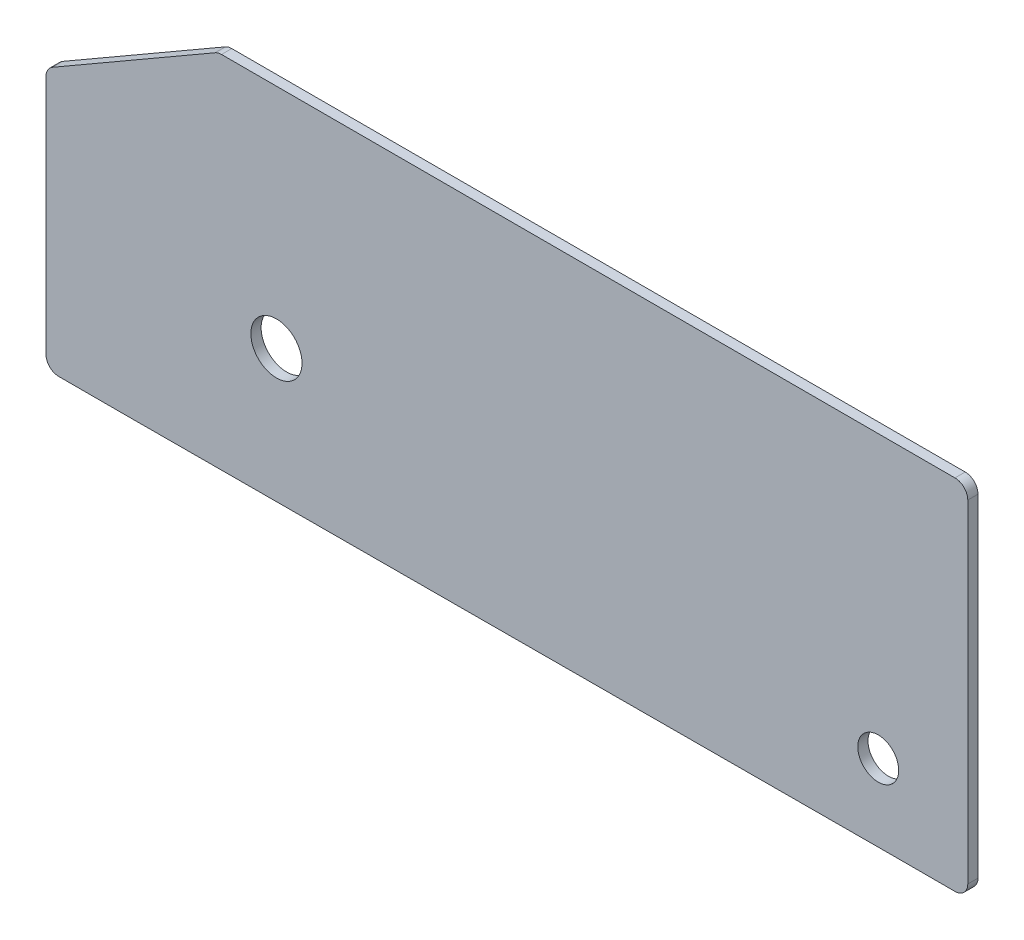
ISO-10303-21;
HEADER;
FILE_DESCRIPTION(('STEP AP214'),'2;1');
FILE_NAME('part.step','',(''),(''),'','','');
FILE_SCHEMA(('AUTOMOTIVE_DESIGN { 1 0 10303 214 1 1 1 1 }'));
ENDSEC;
DATA;
#1=APPLICATION_CONTEXT('core data for automotive mechanical design processes');
#2=APPLICATION_PROTOCOL_DEFINITION('international standard','automotive_design',2000,#1);
#3=PRODUCT_CONTEXT('',#1,'mechanical');
#4=PRODUCT('Part','Part','',(#3));
#5=PRODUCT_RELATED_PRODUCT_CATEGORY('part','',(#4));
#6=PRODUCT_DEFINITION_FORMATION('','',#4);
#7=PRODUCT_DEFINITION_CONTEXT('part definition',#1,'design');
#8=PRODUCT_DEFINITION('design','',#6,#7);
#9=PRODUCT_DEFINITION_SHAPE('','',#8);
#10=(LENGTH_UNIT() NAMED_UNIT(*) SI_UNIT(.MILLI.,.METRE.));
#11=(NAMED_UNIT(*) PLANE_ANGLE_UNIT() SI_UNIT($,.RADIAN.));
#12=(NAMED_UNIT(*) SI_UNIT($,.STERADIAN.) SOLID_ANGLE_UNIT());
#13=UNCERTAINTY_MEASURE_WITH_UNIT(LENGTH_MEASURE(1.E-05),#10,'distance_accuracy_value','');
#14=(GEOMETRIC_REPRESENTATION_CONTEXT(3) GLOBAL_UNCERTAINTY_ASSIGNED_CONTEXT((#13)) GLOBAL_UNIT_ASSIGNED_CONTEXT((#10,
#11,#12)) REPRESENTATION_CONTEXT('',''));
#15=CARTESIAN_POINT('',(0.,0.,0.));
#16=DIRECTION('',(0.,0.,1.));
#17=DIRECTION('',(1.,0.,0.));
#18=AXIS2_PLACEMENT_3D('',#15,#16,#17);
#19=CARTESIAN_POINT('',(16.6618909324501,12.5158151566673,-2.));
#20=DIRECTION('',(0.,0.,1.));
#21=DIRECTION('',(1.,0.,0.));
#22=AXIS2_PLACEMENT_3D('',#19,#20,#21);
#23=CYLINDRICAL_SURFACE('',#22,2.5);
#24=CARTESIAN_POINT('',(16.6618909324501,12.5158151566673,0.));
#25=DIRECTION('',(0.,0.,1.));
#26=DIRECTION('',(1.,0.,0.));
#27=AXIS2_PLACEMENT_3D('',#24,#25,#26);
#28=CIRCLE('',#27,2.5);
#29=CARTESIAN_POINT('',(16.6618909324501,10.0158151566673,0.));
#30=VERTEX_POINT('',#29);
#31=CARTESIAN_POINT('',(19.1618909324501,12.5158151566673,0.));
#32=VERTEX_POINT('',#31);
#33=EDGE_CURVE('E175',#30,#32,#28,.T.);
#34=ORIENTED_EDGE('',*,*,#33,.F.);
#35=DIRECTION('',(0.,0.,1.));
#36=VECTOR('',#35,1.);
#37=CARTESIAN_POINT('',(16.6618909324501,10.0158151566673,-2.));
#38=LINE('',#37,#36);
#39=CARTESIAN_POINT('',(16.6618909324501,10.0158151566673,-2.));
#40=VERTEX_POINT('',#39);
#41=EDGE_CURVE('E11',#40,#30,#38,.T.);
#42=ORIENTED_EDGE('',*,*,#41,.F.);
#43=CARTESIAN_POINT('',(16.6618909324501,12.5158151566673,-2.));
#44=DIRECTION('',(0.,0.,1.));
#45=DIRECTION('',(1.,0.,0.));
#46=AXIS2_PLACEMENT_3D('',#43,#44,#45);
#47=CIRCLE('',#46,2.5);
#48=CARTESIAN_POINT('',(19.1618909324501,12.5158151566673,-2.));
#49=VERTEX_POINT('',#48);
#50=EDGE_CURVE('E219',#40,#49,#47,.T.);
#51=ORIENTED_EDGE('',*,*,#50,.T.);
#52=DIRECTION('',(0.,0.,1.));
#53=VECTOR('',#52,1.);
#54=CARTESIAN_POINT('',(19.1618909324501,12.5158151566673,-2.));
#55=LINE('',#54,#53);
#56=EDGE_CURVE('E116',#49,#32,#55,.T.);
#57=ORIENTED_EDGE('',*,*,#56,.T.);
#58=EDGE_LOOP('',(#34,#42,#51,#57));
#59=FACE_BOUND('',#58,.T.);
#60=ADVANCED_FACE('F47',(#59),#23,.T.);
#61=CARTESIAN_POINT('',(16.6618909324501,10.0158151566673,-2.));
#62=DIRECTION('',(0.,-1.,0.));
#63=DIRECTION('',(1.,0.,0.));
#64=AXIS2_PLACEMENT_3D('',#61,#62,#63);
#65=PLANE('',#64);
#66=DIRECTION('',(1.,0.,0.));
#67=VECTOR('',#66,1.);
#68=CARTESIAN_POINT('',(16.6618909324501,10.0158151566673,0.));
#69=LINE('',#68,#67);
#70=CARTESIAN_POINT('',(4.16189093245009,10.0158151566672,0.));
#71=VERTEX_POINT('',#70);
#72=EDGE_CURVE('E216',#71,#30,#69,.T.);
#73=ORIENTED_EDGE('',*,*,#72,.F.);
#74=DIRECTION('',(0.,0.,1.));
#75=VECTOR('',#74,1.);
#76=CARTESIAN_POINT('',(4.16189093245009,10.0158151566672,-2.));
#77=LINE('',#76,#75);
#78=CARTESIAN_POINT('',(4.16189093245009,10.0158151566672,-2.));
#79=VERTEX_POINT('',#78);
#80=EDGE_CURVE('E57',#79,#71,#77,.T.);
#81=ORIENTED_EDGE('',*,*,#80,.F.);
#82=DIRECTION('',(1.,0.,0.));
#83=VECTOR('',#82,1.);
#84=CARTESIAN_POINT('',(16.6618909324501,10.0158151566673,-2.));
#85=LINE('',#84,#83);
#86=EDGE_CURVE('E161',#79,#40,#85,.T.);
#87=ORIENTED_EDGE('',*,*,#86,.T.);
#88=ORIENTED_EDGE('',*,*,#41,.T.);
#89=EDGE_LOOP('',(#73,#81,#87,#88));
#90=FACE_BOUND('',#89,.T.);
#91=ADVANCED_FACE('F250',(#90),#65,.T.);
#92=CARTESIAN_POINT('',(-146.015023603791,9.59316542585693,-2.));
#93=DIRECTION('',(0.00281433440231589,-0.999996039753094,0.));
#94=DIRECTION('',(0.999996039753094,0.00281433440231589,0.));
#95=AXIS2_PLACEMENT_3D('',#92,#93,#94);
#96=PLANE('',#95);
#97=DIRECTION('',(0.999996039753094,0.00281433440231589,0.));
#98=VECTOR('',#97,1.);
#99=CARTESIAN_POINT('',(-146.015023603791,9.59316542585693,0.));
#100=LINE('',#99,#98);
#101=CARTESIAN_POINT('',(-146.015023603791,9.59316542585693,0.));
#102=VERTEX_POINT('',#101);
#103=EDGE_CURVE('E147',#102,#71,#100,.T.);
#104=ORIENTED_EDGE('',*,*,#103,.F.);
#105=DIRECTION('',(0.,0.,1.));
#106=VECTOR('',#105,1.);
#107=CARTESIAN_POINT('',(-146.015023603791,9.59316542585693,-2.));
#108=LINE('',#107,#106);
#109=CARTESIAN_POINT('',(-146.015023603791,9.59316542585693,-2.));
#110=VERTEX_POINT('',#109);
#111=EDGE_CURVE('E142',#110,#102,#108,.T.);
#112=ORIENTED_EDGE('',*,*,#111,.F.);
#113=DIRECTION('',(0.999996039753094,0.00281433440231589,0.));
#114=VECTOR('',#113,1.);
#115=CARTESIAN_POINT('',(-146.015023603791,9.59316542585693,-2.));
#116=LINE('',#115,#114);
#117=EDGE_CURVE('E145',#110,#79,#116,.T.);
#118=ORIENTED_EDGE('',*,*,#117,.T.);
#119=ORIENTED_EDGE('',*,*,#80,.T.);
#120=EDGE_LOOP('',(#104,#112,#118,#119));
#121=FACE_BOUND('',#120,.T.);
#122=ADVANCED_FACE('F144',(#121),#96,.T.);
#123=CARTESIAN_POINT('',(-146.015023603791,9.59316542585693,-2.));
#124=DIRECTION('',(0.,-1.,0.));
#125=DIRECTION('',(1.,0.,0.));
#126=AXIS2_PLACEMENT_3D('',#123,#124,#125);
#127=PLANE('',#126);
#128=DIRECTION('',(1.,0.,0.));
#129=VECTOR('',#128,1.);
#130=CARTESIAN_POINT('',(-146.015023603791,9.59316542585693,0.));
#131=LINE('',#130,#129);
#132=CARTESIAN_POINT('',(-158.515023603791,9.59316542585711,0.));
#133=VERTEX_POINT('',#132);
#134=EDGE_CURVE('E211',#133,#102,#131,.T.);
#135=ORIENTED_EDGE('',*,*,#134,.F.);
#136=DIRECTION('',(0.,0.,1.));
#137=VECTOR('',#136,1.);
#138=CARTESIAN_POINT('',(-158.515023603791,9.59316542585711,-2.));
#139=LINE('',#138,#137);
#140=CARTESIAN_POINT('',(-158.515023603791,9.59316542585711,-2.));
#141=VERTEX_POINT('',#140);
#142=EDGE_CURVE('E153',#141,#133,#139,.T.);
#143=ORIENTED_EDGE('',*,*,#142,.F.);
#144=DIRECTION('',(1.,0.,0.));
#145=VECTOR('',#144,1.);
#146=CARTESIAN_POINT('',(-146.015023603791,9.59316542585693,-2.));
#147=LINE('',#146,#145);
#148=EDGE_CURVE('E159',#141,#110,#147,.T.);
#149=ORIENTED_EDGE('',*,*,#148,.T.);
#150=ORIENTED_EDGE('',*,*,#111,.T.);
#151=EDGE_LOOP('',(#135,#143,#149,#150));
#152=FACE_BOUND('',#151,.T.);
#153=ADVANCED_FACE('F164',(#152),#127,.T.);
#154=CARTESIAN_POINT('',(-158.51502360379,12.0931654258571,-2.));
#155=DIRECTION('',(0.,0.,1.));
#156=DIRECTION('',(1.,0.,0.));
#157=AXIS2_PLACEMENT_3D('',#154,#155,#156);
#158=CYLINDRICAL_SURFACE('',#157,2.50000000000002);
#159=CARTESIAN_POINT('',(-158.51502360379,12.0931654258571,0.));
#160=DIRECTION('',(0.,0.,1.));
#161=DIRECTION('',(1.,0.,0.));
#162=AXIS2_PLACEMENT_3D('',#159,#160,#161);
#163=CIRCLE('',#162,2.50000000000002);
#164=CARTESIAN_POINT('',(-161.01502360379,12.0931654258571,0.));
#165=VERTEX_POINT('',#164);
#166=EDGE_CURVE('E207',#165,#133,#163,.T.);
#167=ORIENTED_EDGE('',*,*,#166,.F.);
#168=DIRECTION('',(0.,0.,1.));
#169=VECTOR('',#168,1.);
#170=CARTESIAN_POINT('',(-161.01502360379,12.0931654258571,-2.));
#171=LINE('',#170,#169);
#172=CARTESIAN_POINT('',(-161.01502360379,12.0931654258571,-2.));
#173=VERTEX_POINT('',#172);
#174=EDGE_CURVE('E225',#173,#165,#171,.T.);
#175=ORIENTED_EDGE('',*,*,#174,.F.);
#176=CARTESIAN_POINT('',(-158.51502360379,12.0931654258571,-2.));
#177=DIRECTION('',(0.,0.,1.));
#178=DIRECTION('',(1.,0.,0.));
#179=AXIS2_PLACEMENT_3D('',#176,#177,#178);
#180=CIRCLE('',#179,2.50000000000002);
#181=EDGE_CURVE('E166',#173,#141,#180,.T.);
#182=ORIENTED_EDGE('',*,*,#181,.T.);
#183=ORIENTED_EDGE('',*,*,#142,.T.);
#184=EDGE_LOOP('',(#167,#175,#182,#183));
#185=FACE_BOUND('',#184,.T.);
#186=ADVANCED_FACE('F263',(#185),#158,.T.);
#187=CARTESIAN_POINT('',(-161.01502360379,59.1497897528832,-2.));
#188=DIRECTION('',(-1.,0.,0.));
#189=DIRECTION('',(0.,-1.,0.));
#190=AXIS2_PLACEMENT_3D('',#187,#188,#189);
#191=PLANE('',#190);
#192=DIRECTION('',(0.,-1.,0.));
#193=VECTOR('',#192,1.);
#194=CARTESIAN_POINT('',(-161.01502360379,59.1497897528832,0.));
#195=LINE('',#194,#193);
#196=CARTESIAN_POINT('',(-161.01502360379,59.1497897528832,0.));
#197=VERTEX_POINT('',#196);
#198=EDGE_CURVE('E203',#197,#165,#195,.T.);
#199=ORIENTED_EDGE('',*,*,#198,.F.);
#200=DIRECTION('',(0.,0.,1.));
#201=VECTOR('',#200,1.);
#202=CARTESIAN_POINT('',(-161.01502360379,59.1497897528832,-2.));
#203=LINE('',#202,#201);
#204=CARTESIAN_POINT('',(-161.01502360379,59.1497897528832,-2.));
#205=VERTEX_POINT('',#204);
#206=EDGE_CURVE('E228',#205,#197,#203,.T.);
#207=ORIENTED_EDGE('',*,*,#206,.F.);
#208=DIRECTION('',(0.,-1.,0.));
#209=VECTOR('',#208,1.);
#210=CARTESIAN_POINT('',(-161.01502360379,59.1497897528832,-2.));
#211=LINE('',#210,#209);
#212=EDGE_CURVE('E169',#205,#173,#211,.T.);
#213=ORIENTED_EDGE('',*,*,#212,.T.);
#214=ORIENTED_EDGE('',*,*,#174,.T.);
#215=EDGE_LOOP('',(#199,#207,#213,#214));
#216=FACE_BOUND('',#215,.T.);
#217=ADVANCED_FACE('F266',(#216),#191,.T.);
#218=CARTESIAN_POINT('',(-158.51502360379,59.1497897528831,-2.));
#219=DIRECTION('',(0.,0.,1.));
#220=DIRECTION('',(1.,0.,0.));
#221=AXIS2_PLACEMENT_3D('',#218,#219,#220);
#222=CYLINDRICAL_SURFACE('',#221,2.49999999999999);
#223=CARTESIAN_POINT('',(-158.51502360379,59.1497897528831,0.));
#224=DIRECTION('',(0.,0.,1.));
#225=DIRECTION('',(1.,0.,0.));
#226=AXIS2_PLACEMENT_3D('',#223,#224,#225);
#227=CIRCLE('',#226,2.49999999999999);
#228=CARTESIAN_POINT('',(-159.76502360379,61.3148532623442,0.));
#229=VERTEX_POINT('',#228);
#230=EDGE_CURVE('E199',#229,#197,#227,.T.);
#231=ORIENTED_EDGE('',*,*,#230,.F.);
#232=DIRECTION('',(0.,0.,1.));
#233=VECTOR('',#232,1.);
#234=CARTESIAN_POINT('',(-159.76502360379,61.3148532623442,-2.));
#235=LINE('',#234,#233);
#236=CARTESIAN_POINT('',(-159.76502360379,61.3148532623442,-2.));
#237=VERTEX_POINT('',#236);
#238=EDGE_CURVE('E231',#237,#229,#235,.T.);
#239=ORIENTED_EDGE('',*,*,#238,.F.);
#240=CARTESIAN_POINT('',(-158.51502360379,59.1497897528831,-2.));
#241=DIRECTION('',(0.,0.,1.));
#242=DIRECTION('',(1.,0.,0.));
#243=AXIS2_PLACEMENT_3D('',#240,#241,#242);
#244=CIRCLE('',#243,2.49999999999999);
#245=EDGE_CURVE('E347',#237,#205,#244,.T.);
#246=ORIENTED_EDGE('',*,*,#245,.T.);
#247=ORIENTED_EDGE('',*,*,#206,.T.);
#248=EDGE_LOOP('',(#231,#239,#246,#247));
#249=FACE_BOUND('',#248,.T.);
#250=ADVANCED_FACE('F270',(#249),#222,.T.);
#251=CARTESIAN_POINT('',(-127.954134471335,79.6808786661285,-2.));
#252=DIRECTION('',(-0.499999999999995,0.866025403784441,0.));
#253=DIRECTION('',(-0.866025403784441,-0.499999999999995,0.));
#254=AXIS2_PLACEMENT_3D('',#251,#252,#253);
#255=PLANE('',#254);
#256=DIRECTION('',(-0.866025403784441,-0.499999999999995,0.));
#257=VECTOR('',#256,1.);
#258=CARTESIAN_POINT('',(-127.954134471335,79.6808786661285,0.));
#259=LINE('',#258,#257);
#260=CARTESIAN_POINT('',(-127.954134471335,79.6808786661285,0.));
#261=VERTEX_POINT('',#260);
#262=EDGE_CURVE('E195',#261,#229,#259,.T.);
#263=ORIENTED_EDGE('',*,*,#262,.F.);
#264=DIRECTION('',(0.,0.,1.));
#265=VECTOR('',#264,1.);
#266=CARTESIAN_POINT('',(-127.954134471335,79.6808786661285,-2.));
#267=LINE('',#266,#265);
#268=CARTESIAN_POINT('',(-127.954134471335,79.6808786661285,-2.));
#269=VERTEX_POINT('',#268);
#270=EDGE_CURVE('E234',#269,#261,#267,.T.);
#271=ORIENTED_EDGE('',*,*,#270,.F.);
#272=DIRECTION('',(-0.866025403784441,-0.499999999999995,0.));
#273=VECTOR('',#272,1.);
#274=CARTESIAN_POINT('',(-127.954134471335,79.6808786661285,-2.));
#275=LINE('',#274,#273);
#276=EDGE_CURVE('E343',#269,#237,#275,.T.);
#277=ORIENTED_EDGE('',*,*,#276,.T.);
#278=ORIENTED_EDGE('',*,*,#238,.T.);
#279=EDGE_LOOP('',(#263,#271,#277,#278));
#280=FACE_BOUND('',#279,.T.);
#281=ADVANCED_FACE('F274',(#280),#255,.T.);
#282=CARTESIAN_POINT('',(-126.704134471335,77.5158151566673,-2.));
#283=DIRECTION('',(0.,0.,1.));
#284=DIRECTION('',(1.,0.,0.));
#285=AXIS2_PLACEMENT_3D('',#282,#283,#284);
#286=CYLINDRICAL_SURFACE('',#285,2.5);
#287=CARTESIAN_POINT('',(-126.704134471335,77.5158151566673,0.));
#288=DIRECTION('',(0.,0.,1.));
#289=DIRECTION('',(1.,0.,0.));
#290=AXIS2_PLACEMENT_3D('',#287,#288,#289);
#291=CIRCLE('',#290,2.5);
#292=CARTESIAN_POINT('',(-126.704134471335,80.0158151566673,0.));
#293=VERTEX_POINT('',#292);
#294=EDGE_CURVE('E191',#293,#261,#291,.T.);
#295=ORIENTED_EDGE('',*,*,#294,.F.);
#296=DIRECTION('',(0.,0.,1.));
#297=VECTOR('',#296,1.);
#298=CARTESIAN_POINT('',(-126.704134471335,80.0158151566673,-2.));
#299=LINE('',#298,#297);
#300=CARTESIAN_POINT('',(-126.704134471335,80.0158151566673,-2.));
#301=VERTEX_POINT('',#300);
#302=EDGE_CURVE('E237',#301,#293,#299,.T.);
#303=ORIENTED_EDGE('',*,*,#302,.F.);
#304=CARTESIAN_POINT('',(-126.704134471335,77.5158151566673,-2.));
#305=DIRECTION('',(0.,0.,1.));
#306=DIRECTION('',(1.,0.,0.));
#307=AXIS2_PLACEMENT_3D('',#304,#305,#306);
#308=CIRCLE('',#307,2.5);
#309=EDGE_CURVE('E339',#301,#269,#308,.T.);
#310=ORIENTED_EDGE('',*,*,#309,.T.);
#311=ORIENTED_EDGE('',*,*,#270,.T.);
#312=EDGE_LOOP('',(#295,#303,#310,#311));
#313=FACE_BOUND('',#312,.T.);
#314=ADVANCED_FACE('F278',(#313),#286,.T.);
#315=CARTESIAN_POINT('',(-126.704134471335,80.0158151566673,-2.));
#316=DIRECTION('',(0.,1.,0.));
#317=DIRECTION('',(-1.,0.,0.));
#318=AXIS2_PLACEMENT_3D('',#315,#316,#317);
#319=PLANE('',#318);
#320=DIRECTION('',(-1.,0.,0.));
#321=VECTOR('',#320,1.);
#322=CARTESIAN_POINT('',(-126.704134471335,80.0158151566673,0.));
#323=LINE('',#322,#321);
#324=CARTESIAN_POINT('',(16.6618909324498,80.0158151566673,0.));
#325=VERTEX_POINT('',#324);
#326=EDGE_CURVE('E187',#325,#293,#323,.T.);
#327=ORIENTED_EDGE('',*,*,#326,.F.);
#328=DIRECTION('',(0.,0.,1.));
#329=VECTOR('',#328,1.);
#330=CARTESIAN_POINT('',(16.6618909324498,80.0158151566673,-2.));
#331=LINE('',#330,#329);
#332=CARTESIAN_POINT('',(16.6618909324498,80.0158151566673,-2.));
#333=VERTEX_POINT('',#332);
#334=EDGE_CURVE('E240',#333,#325,#331,.T.);
#335=ORIENTED_EDGE('',*,*,#334,.F.);
#336=DIRECTION('',(-1.,0.,0.));
#337=VECTOR('',#336,1.);
#338=CARTESIAN_POINT('',(-126.704134471335,80.0158151566673,-2.));
#339=LINE('',#338,#337);
#340=EDGE_CURVE('E335',#333,#301,#339,.T.);
#341=ORIENTED_EDGE('',*,*,#340,.T.);
#342=ORIENTED_EDGE('',*,*,#302,.T.);
#343=EDGE_LOOP('',(#327,#335,#341,#342));
#344=FACE_BOUND('',#343,.T.);
#345=ADVANCED_FACE('F282',(#344),#319,.T.);
#346=CARTESIAN_POINT('',(16.6618909324498,77.5158151566673,-2.));
#347=DIRECTION('',(0.,0.,1.));
#348=DIRECTION('',(1.,0.,0.));
#349=AXIS2_PLACEMENT_3D('',#346,#347,#348);
#350=CYLINDRICAL_SURFACE('',#349,2.50000000000001);
#351=CARTESIAN_POINT('',(16.6618909324498,77.5158151566673,0.));
#352=DIRECTION('',(0.,0.,1.));
#353=DIRECTION('',(1.,0.,0.));
#354=AXIS2_PLACEMENT_3D('',#351,#352,#353);
#355=CIRCLE('',#354,2.50000000000001);
#356=CARTESIAN_POINT('',(19.1618909324498,77.5158151566673,0.));
#357=VERTEX_POINT('',#356);
#358=EDGE_CURVE('E183',#357,#325,#355,.T.);
#359=ORIENTED_EDGE('',*,*,#358,.F.);
#360=DIRECTION('',(0.,0.,1.));
#361=VECTOR('',#360,1.);
#362=CARTESIAN_POINT('',(19.1618909324498,77.5158151566673,-2.));
#363=LINE('',#362,#361);
#364=CARTESIAN_POINT('',(19.1618909324498,77.5158151566673,-2.));
#365=VERTEX_POINT('',#364);
#366=EDGE_CURVE('E243',#365,#357,#363,.T.);
#367=ORIENTED_EDGE('',*,*,#366,.F.);
#368=CARTESIAN_POINT('',(16.6618909324498,77.5158151566673,-2.));
#369=DIRECTION('',(0.,0.,1.));
#370=DIRECTION('',(1.,0.,0.));
#371=AXIS2_PLACEMENT_3D('',#368,#369,#370);
#372=CIRCLE('',#371,2.50000000000001);
#373=EDGE_CURVE('E331',#365,#333,#372,.T.);
#374=ORIENTED_EDGE('',*,*,#373,.T.);
#375=ORIENTED_EDGE('',*,*,#334,.T.);
#376=EDGE_LOOP('',(#359,#367,#374,#375));
#377=FACE_BOUND('',#376,.T.);
#378=ADVANCED_FACE('F286',(#377),#350,.T.);
#379=CARTESIAN_POINT('',(19.1618909324499,77.5158151566673,-2.));
#380=DIRECTION('',(1.,0.,0.));
#381=DIRECTION('',(0.,1.,0.));
#382=AXIS2_PLACEMENT_3D('',#379,#380,#381);
#383=PLANE('',#382);
#384=DIRECTION('',(0.,1.,0.));
#385=VECTOR('',#384,1.);
#386=CARTESIAN_POINT('',(19.1618909324499,77.5158151566673,0.));
#387=LINE('',#386,#385);
#388=EDGE_CURVE('E179',#32,#357,#387,.T.);
#389=ORIENTED_EDGE('',*,*,#388,.F.);
#390=ORIENTED_EDGE('',*,*,#56,.F.);
#391=DIRECTION('',(0.,1.,0.));
#392=VECTOR('',#391,1.);
#393=CARTESIAN_POINT('',(19.1618909324499,77.5158151566673,-2.));
#394=LINE('',#393,#392);
#395=EDGE_CURVE('E328',#49,#365,#394,.T.);
#396=ORIENTED_EDGE('',*,*,#395,.T.);
#397=ORIENTED_EDGE('',*,*,#366,.T.);
#398=EDGE_LOOP('',(#389,#390,#396,#397));
#399=FACE_BOUND('',#398,.T.);
#400=ADVANCED_FACE('F246',(#399),#383,.T.);
#401=CARTESIAN_POINT('',(16.6618909324501,12.5158151566673,-2.));
#402=DIRECTION('',(0.,0.,1.));
#403=DIRECTION('',(1.,0.,0.));
#404=AXIS2_PLACEMENT_3D('',#401,#402,#403);
#405=PLANE('',#404);
#406=CARTESIAN_POINT('',(1.66189093245012,25.0158151566673,-2.));
#407=DIRECTION('',(0.,0.,1.));
#408=DIRECTION('',(1.,0.,0.));
#409=AXIS2_PLACEMENT_3D('',#406,#407,#408);
#410=CIRCLE('',#409,4.);
#411=CARTESIAN_POINT('',(5.66189093245012,25.0158151566673,-2.));
#412=VERTEX_POINT('',#411);
#413=EDGE_CURVE('E316',#412,#412,#410,.T.);
#414=ORIENTED_EDGE('',*,*,#413,.T.);
#415=EDGE_LOOP('',(#414));
#416=FACE_BOUND('',#415,.T.);
#417=CARTESIAN_POINT('',(-115.97079496973,35.6214775893701,-2.));
#418=DIRECTION('',(0.,0.,-1.));
#419=DIRECTION('',(-1.,0.,0.));
#420=AXIS2_PLACEMENT_3D('',#417,#418,#419);
#421=CIRCLE('',#420,5.);
#422=CARTESIAN_POINT('',(-120.97079496973,35.6214775893701,-2.));
#423=VERTEX_POINT('',#422);
#424=EDGE_CURVE('E318',#423,#423,#421,.T.);
#425=ORIENTED_EDGE('',*,*,#424,.F.);
#426=EDGE_LOOP('',(#425));
#427=FACE_BOUND('',#426,.T.);
#428=ORIENTED_EDGE('',*,*,#50,.F.);
#429=ORIENTED_EDGE('',*,*,#86,.F.);
#430=ORIENTED_EDGE('',*,*,#117,.F.);
#431=ORIENTED_EDGE('',*,*,#148,.F.);
#432=ORIENTED_EDGE('',*,*,#181,.F.);
#433=ORIENTED_EDGE('',*,*,#212,.F.);
#434=ORIENTED_EDGE('',*,*,#245,.F.);
#435=ORIENTED_EDGE('',*,*,#276,.F.);
#436=ORIENTED_EDGE('',*,*,#309,.F.);
#437=ORIENTED_EDGE('',*,*,#340,.F.);
#438=ORIENTED_EDGE('',*,*,#373,.F.);
#439=ORIENTED_EDGE('',*,*,#395,.F.);
#440=EDGE_LOOP('',(#428,#429,#430,#431,#432,#433,#434,#435,#436,#437,#438,#439));
#441=FACE_BOUND('',#440,.T.);
#442=ADVANCED_FACE('F157',(#416,#427,#441),#405,.F.);
#443=CARTESIAN_POINT('',(16.6618909324501,12.5158151566673,0.));
#444=DIRECTION('',(0.,0.,1.));
#445=DIRECTION('',(1.,0.,0.));
#446=AXIS2_PLACEMENT_3D('',#443,#444,#445);
#447=PLANE('',#446);
#448=CARTESIAN_POINT('',(1.66189093245012,25.0158151566673,0.));
#449=DIRECTION('',(0.,0.,1.));
#450=DIRECTION('',(1.,0.,0.));
#451=AXIS2_PLACEMENT_3D('',#448,#449,#450);
#452=CIRCLE('',#451,4.);
#453=CARTESIAN_POINT('',(5.66189093245012,25.0158151566673,0.));
#454=VERTEX_POINT('',#453);
#455=EDGE_CURVE('E314',#454,#454,#452,.T.);
#456=ORIENTED_EDGE('',*,*,#455,.F.);
#457=EDGE_LOOP('',(#456));
#458=FACE_BOUND('',#457,.T.);
#459=CARTESIAN_POINT('',(-115.97079496973,35.6214775893701,0.));
#460=DIRECTION('',(0.,0.,1.));
#461=DIRECTION('',(1.,0.,0.));
#462=AXIS2_PLACEMENT_3D('',#459,#460,#461);
#463=CIRCLE('',#462,5.);
#464=CARTESIAN_POINT('',(-110.97079496973,35.6214775893701,0.));
#465=VERTEX_POINT('',#464);
#466=EDGE_CURVE('E50',#465,#465,#463,.T.);
#467=ORIENTED_EDGE('',*,*,#466,.F.);
#468=EDGE_LOOP('',(#467));
#469=FACE_BOUND('',#468,.T.);
#470=ORIENTED_EDGE('',*,*,#33,.T.);
#471=ORIENTED_EDGE('',*,*,#388,.T.);
#472=ORIENTED_EDGE('',*,*,#358,.T.);
#473=ORIENTED_EDGE('',*,*,#326,.T.);
#474=ORIENTED_EDGE('',*,*,#294,.T.);
#475=ORIENTED_EDGE('',*,*,#262,.T.);
#476=ORIENTED_EDGE('',*,*,#230,.T.);
#477=ORIENTED_EDGE('',*,*,#198,.T.);
#478=ORIENTED_EDGE('',*,*,#166,.T.);
#479=ORIENTED_EDGE('',*,*,#134,.T.);
#480=ORIENTED_EDGE('',*,*,#103,.T.);
#481=ORIENTED_EDGE('',*,*,#72,.T.);
#482=EDGE_LOOP('',(#470,#471,#472,#473,#474,#475,#476,#477,#478,#479,#480,#481));
#483=FACE_BOUND('',#482,.T.);
#484=ADVANCED_FACE('F249',(#458,#469,#483),#447,.T.);
#485=CARTESIAN_POINT('',(-115.97079496973,35.6214775893701,8.));
#486=DIRECTION('',(0.,0.,-1.));
#487=DIRECTION('',(-1.,0.,0.));
#488=AXIS2_PLACEMENT_3D('',#485,#486,#487);
#489=CYLINDRICAL_SURFACE('',#488,5.);
#490=ORIENTED_EDGE('',*,*,#466,.T.);
#491=EDGE_LOOP('',(#490));
#492=FACE_BOUND('',#491,.T.);
#493=ORIENTED_EDGE('',*,*,#424,.T.);
#494=EDGE_LOOP('',(#493));
#495=FACE_BOUND('',#494,.T.);
#496=ADVANCED_FACE('F299',(#492,#495),#489,.F.);
#497=CARTESIAN_POINT('',(1.66189093245012,25.0158151566673,-10.));
#498=DIRECTION('',(0.,0.,1.));
#499=DIRECTION('',(1.,0.,0.));
#500=AXIS2_PLACEMENT_3D('',#497,#498,#499);
#501=CYLINDRICAL_SURFACE('',#500,4.);
#502=ORIENTED_EDGE('',*,*,#455,.T.);
#503=EDGE_LOOP('',(#502));
#504=FACE_BOUND('',#503,.T.);
#505=ORIENTED_EDGE('',*,*,#413,.F.);
#506=EDGE_LOOP('',(#505));
#507=FACE_BOUND('',#506,.T.);
#508=ADVANCED_FACE('F305',(#504,#507),#501,.F.);
#509=CLOSED_SHELL('',(#60,#91,#122,#153,#186,#217,#250,#281,#314,#345,#378,#400,#442,#484,#496,#508));
#510=MANIFOLD_SOLID_BREP('B2',#509);
#511=ADVANCED_BREP_SHAPE_REPRESENTATION('',(#18,#510),#14);
#512=SHAPE_DEFINITION_REPRESENTATION(#9,#511);
ENDSEC;
END-ISO-10303-21;
